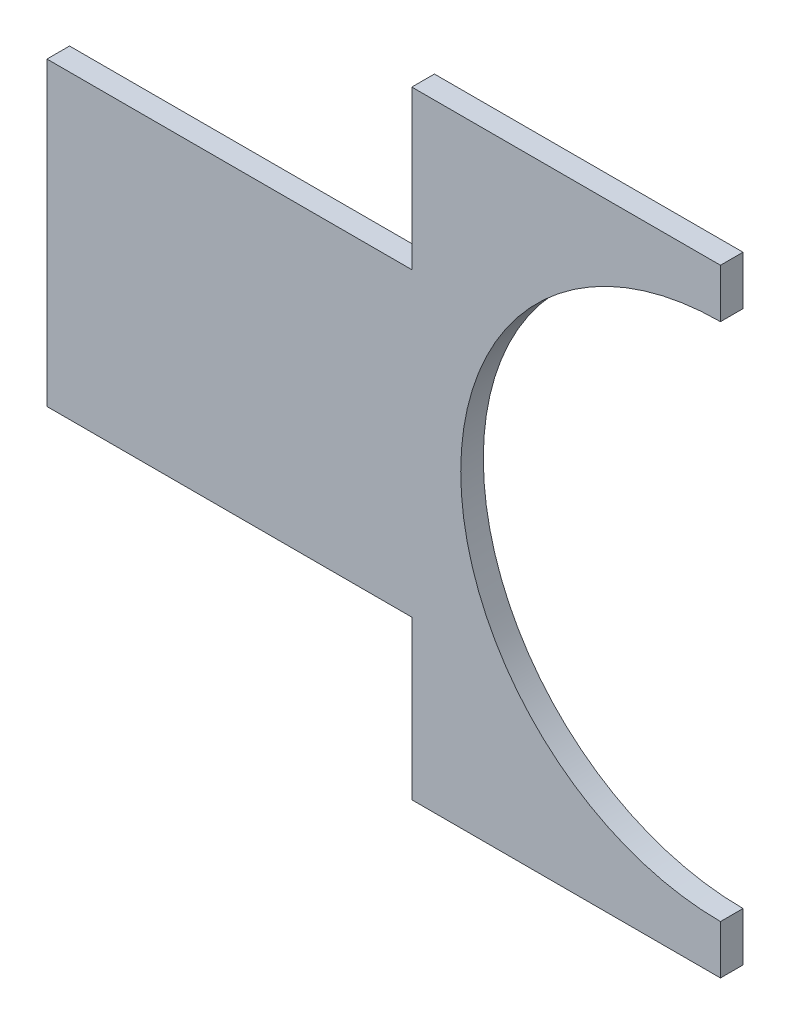
ISO-10303-21;
HEADER;
FILE_DESCRIPTION(('STEP AP214'),'2;1');
FILE_NAME('part.step','',(''),(''),'','','');
FILE_SCHEMA(('AUTOMOTIVE_DESIGN { 1 0 10303 214 1 1 1 1 }'));
ENDSEC;
DATA;
#1=APPLICATION_CONTEXT('core data for automotive mechanical design processes');
#2=APPLICATION_PROTOCOL_DEFINITION('international standard','automotive_design',2000,#1);
#3=PRODUCT_CONTEXT('',#1,'mechanical');
#4=PRODUCT('Part','Part','',(#3));
#5=PRODUCT_RELATED_PRODUCT_CATEGORY('part','',(#4));
#6=PRODUCT_DEFINITION_FORMATION('','',#4);
#7=PRODUCT_DEFINITION_CONTEXT('part definition',#1,'design');
#8=PRODUCT_DEFINITION('design','',#6,#7);
#9=PRODUCT_DEFINITION_SHAPE('','',#8);
#10=(LENGTH_UNIT() NAMED_UNIT(*) SI_UNIT(.MILLI.,.METRE.));
#11=(NAMED_UNIT(*) PLANE_ANGLE_UNIT() SI_UNIT($,.RADIAN.));
#12=(NAMED_UNIT(*) SI_UNIT($,.STERADIAN.) SOLID_ANGLE_UNIT());
#13=UNCERTAINTY_MEASURE_WITH_UNIT(LENGTH_MEASURE(1.E-05),#10,'distance_accuracy_value','');
#14=(GEOMETRIC_REPRESENTATION_CONTEXT(3) GLOBAL_UNCERTAINTY_ASSIGNED_CONTEXT((#13)) GLOBAL_UNIT_ASSIGNED_CONTEXT((#10,
#11,#12)) REPRESENTATION_CONTEXT('',''));
#15=CARTESIAN_POINT('',(0.,0.,0.));
#16=DIRECTION('',(0.,0.,1.));
#17=DIRECTION('',(1.,0.,0.));
#18=AXIS2_PLACEMENT_3D('',#15,#16,#17);
#19=CARTESIAN_POINT('',(-55.,40.,6.));
#20=DIRECTION('',(1.,0.,0.));
#21=DIRECTION('',(0.,1.,0.));
#22=AXIS2_PLACEMENT_3D('',#19,#20,#21);
#23=PLANE('',#22);
#24=DIRECTION('',(0.,-1.,0.));
#25=VECTOR('',#24,1.);
#26=CARTESIAN_POINT('',(-55.,40.,0.));
#27=LINE('',#26,#25);
#28=CARTESIAN_POINT('',(-55.,40.,0.));
#29=VERTEX_POINT('',#28);
#30=CARTESIAN_POINT('',(-55.,-40.,0.));
#31=VERTEX_POINT('',#30);
#32=EDGE_CURVE('E167',#29,#31,#27,.T.);
#33=ORIENTED_EDGE('',*,*,#32,.T.);
#34=DIRECTION('',(0.,0.,-1.));
#35=VECTOR('',#34,1.);
#36=CARTESIAN_POINT('',(-55.,-40.,6.));
#37=LINE('',#36,#35);
#38=CARTESIAN_POINT('',(-55.,-40.,6.));
#39=VERTEX_POINT('',#38);
#40=EDGE_CURVE('E11',#39,#31,#37,.T.);
#41=ORIENTED_EDGE('',*,*,#40,.F.);
#42=DIRECTION('',(0.,-1.,0.));
#43=VECTOR('',#42,1.);
#44=CARTESIAN_POINT('',(-55.,40.,6.));
#45=LINE('',#44,#43);
#46=CARTESIAN_POINT('',(-55.,40.,6.));
#47=VERTEX_POINT('',#46);
#48=EDGE_CURVE('E180',#47,#39,#45,.T.);
#49=ORIENTED_EDGE('',*,*,#48,.F.);
#50=DIRECTION('',(0.,0.,-1.));
#51=VECTOR('',#50,1.);
#52=CARTESIAN_POINT('',(-55.,40.,6.));
#53=LINE('',#52,#51);
#54=EDGE_CURVE('E50',#47,#29,#53,.T.);
#55=ORIENTED_EDGE('',*,*,#54,.T.);
#56=EDGE_LOOP('',(#33,#41,#49,#55));
#57=FACE_BOUND('',#56,.T.);
#58=ADVANCED_FACE('F43',(#57),#23,.F.);
#59=CARTESIAN_POINT('',(55.,-40.,6.));
#60=DIRECTION('',(0.,1.,0.));
#61=DIRECTION('',(-1.,0.,0.));
#62=AXIS2_PLACEMENT_3D('',#59,#60,#61);
#63=PLANE('',#62);
#64=DIRECTION('',(1.,0.,0.));
#65=VECTOR('',#64,1.);
#66=CARTESIAN_POINT('',(55.,-40.,0.));
#67=LINE('',#66,#65);
#68=CARTESIAN_POINT('',(42.,-40.,0.));
#69=VERTEX_POINT('',#68);
#70=EDGE_CURVE('E61',#31,#69,#67,.T.);
#71=ORIENTED_EDGE('',*,*,#70,.T.);
#72=DIRECTION('',(0.,0.,1.));
#73=VECTOR('',#72,1.);
#74=CARTESIAN_POINT('',(42.,-40.,-116.036222792712));
#75=LINE('',#74,#73);
#76=CARTESIAN_POINT('',(42.,-40.,6.));
#77=VERTEX_POINT('',#76);
#78=EDGE_CURVE('E57',#69,#77,#75,.T.);
#79=ORIENTED_EDGE('',*,*,#78,.T.);
#80=DIRECTION('',(1.,0.,0.));
#81=VECTOR('',#80,1.);
#82=CARTESIAN_POINT('',(55.,-40.,6.));
#83=LINE('',#82,#81);
#84=EDGE_CURVE('E138',#39,#77,#83,.T.);
#85=ORIENTED_EDGE('',*,*,#84,.F.);
#86=ORIENTED_EDGE('',*,*,#40,.T.);
#87=EDGE_LOOP('',(#71,#79,#85,#86));
#88=FACE_BOUND('',#87,.T.);
#89=ADVANCED_FACE('F200',(#88),#63,.F.);
#90=CARTESIAN_POINT('',(55.,40.,6.));
#91=DIRECTION('',(0.,-1.,0.));
#92=DIRECTION('',(1.,0.,0.));
#93=AXIS2_PLACEMENT_3D('',#90,#91,#92);
#94=PLANE('',#93);
#95=DIRECTION('',(-1.,0.,0.));
#96=VECTOR('',#95,1.);
#97=CARTESIAN_POINT('',(55.,40.,6.));
#98=LINE('',#97,#96);
#99=CARTESIAN_POINT('',(42.,40.,6.));
#100=VERTEX_POINT('',#99);
#101=EDGE_CURVE('E184',#100,#47,#98,.T.);
#102=ORIENTED_EDGE('',*,*,#101,.F.);
#103=DIRECTION('',(0.,0.,1.));
#104=VECTOR('',#103,1.);
#105=CARTESIAN_POINT('',(42.,40.,-116.036222792712));
#106=LINE('',#105,#104);
#107=CARTESIAN_POINT('',(42.,40.,0.));
#108=VERTEX_POINT('',#107);
#109=EDGE_CURVE('E171',#108,#100,#106,.T.);
#110=ORIENTED_EDGE('',*,*,#109,.F.);
#111=DIRECTION('',(-1.,0.,0.));
#112=VECTOR('',#111,1.);
#113=CARTESIAN_POINT('',(55.,40.,0.));
#114=LINE('',#113,#112);
#115=EDGE_CURVE('E182',#108,#29,#114,.T.);
#116=ORIENTED_EDGE('',*,*,#115,.T.);
#117=ORIENTED_EDGE('',*,*,#54,.F.);
#118=EDGE_LOOP('',(#102,#110,#116,#117));
#119=FACE_BOUND('',#118,.T.);
#120=ADVANCED_FACE('F203',(#119),#94,.F.);
#121=CARTESIAN_POINT('',(0.,0.,6.));
#122=DIRECTION('',(0.,0.,-1.));
#123=DIRECTION('',(-1.,0.,0.));
#124=AXIS2_PLACEMENT_3D('',#121,#122,#123);
#125=PLANE('',#124);
#126=ORIENTED_EDGE('',*,*,#48,.T.);
#127=ORIENTED_EDGE('',*,*,#84,.T.);
#128=DIRECTION('',(0.,-1.,0.));
#129=VECTOR('',#128,1.);
#130=CARTESIAN_POINT('',(42.,0.,6.));
#131=LINE('',#130,#129);
#132=CARTESIAN_POINT('',(42.,-82.05,6.));
#133=VERTEX_POINT('',#132);
#134=EDGE_CURVE('E120',#77,#133,#131,.T.);
#135=ORIENTED_EDGE('',*,*,#134,.T.);
#136=DIRECTION('',(1.,0.,0.));
#137=VECTOR('',#136,1.);
#138=CARTESIAN_POINT('',(0.,-82.05,6.));
#139=LINE('',#138,#137);
#140=CARTESIAN_POINT('',(124.05,-82.05,6.));
#141=VERTEX_POINT('',#140);
#142=EDGE_CURVE('E127',#133,#141,#139,.T.);
#143=ORIENTED_EDGE('',*,*,#142,.T.);
#144=DIRECTION('',(0.,-1.,0.));
#145=VECTOR('',#144,1.);
#146=CARTESIAN_POINT('',(124.05,0.,6.));
#147=LINE('',#146,#145);
#148=CARTESIAN_POINT('',(124.05,-69.05,6.));
#149=VERTEX_POINT('',#148);
#150=EDGE_CURVE('E144',#149,#141,#147,.T.);
#151=ORIENTED_EDGE('',*,*,#150,.F.);
#152=CARTESIAN_POINT('',(124.05,0.,6.));
#153=DIRECTION('',(0.,0.,1.));
#154=DIRECTION('',(1.,0.,0.));
#155=AXIS2_PLACEMENT_3D('',#152,#153,#154);
#156=CIRCLE('',#155,69.05);
#157=CARTESIAN_POINT('',(124.05,69.05,6.));
#158=VERTEX_POINT('',#157);
#159=EDGE_CURVE('E160',#158,#149,#156,.T.);
#160=ORIENTED_EDGE('',*,*,#159,.F.);
#161=DIRECTION('',(0.,-1.,0.));
#162=VECTOR('',#161,1.);
#163=CARTESIAN_POINT('',(124.05,0.,6.));
#164=LINE('',#163,#162);
#165=CARTESIAN_POINT('',(124.05,82.05,6.));
#166=VERTEX_POINT('',#165);
#167=EDGE_CURVE('E152',#166,#158,#164,.T.);
#168=ORIENTED_EDGE('',*,*,#167,.F.);
#169=DIRECTION('',(1.,0.,0.));
#170=VECTOR('',#169,1.);
#171=CARTESIAN_POINT('',(0.,82.05,6.));
#172=LINE('',#171,#170);
#173=CARTESIAN_POINT('',(42.,82.05,6.));
#174=VERTEX_POINT('',#173);
#175=EDGE_CURVE('E153',#174,#166,#172,.T.);
#176=ORIENTED_EDGE('',*,*,#175,.F.);
#177=DIRECTION('',(0.,-1.,0.));
#178=VECTOR('',#177,1.);
#179=CARTESIAN_POINT('',(42.,0.,6.));
#180=LINE('',#179,#178);
#181=EDGE_CURVE('E148',#174,#100,#180,.T.);
#182=ORIENTED_EDGE('',*,*,#181,.T.);
#183=ORIENTED_EDGE('',*,*,#101,.T.);
#184=EDGE_LOOP('',(#126,#127,#135,#143,#151,#160,#168,#176,#182,#183));
#185=FACE_BOUND('',#184,.T.);
#186=ADVANCED_FACE('F137',(#185),#125,.F.);
#187=CARTESIAN_POINT('',(0.,0.,0.));
#188=DIRECTION('',(0.,0.,-1.));
#189=DIRECTION('',(-1.,0.,0.));
#190=AXIS2_PLACEMENT_3D('',#187,#188,#189);
#191=PLANE('',#190);
#192=ORIENTED_EDGE('',*,*,#32,.F.);
#193=ORIENTED_EDGE('',*,*,#115,.F.);
#194=DIRECTION('',(0.,-1.,0.));
#195=VECTOR('',#194,1.);
#196=CARTESIAN_POINT('',(42.,0.,0.));
#197=LINE('',#196,#195);
#198=CARTESIAN_POINT('',(42.,82.05,0.));
#199=VERTEX_POINT('',#198);
#200=EDGE_CURVE('E162',#199,#108,#197,.T.);
#201=ORIENTED_EDGE('',*,*,#200,.F.);
#202=DIRECTION('',(1.,0.,0.));
#203=VECTOR('',#202,1.);
#204=CARTESIAN_POINT('',(0.,82.05,0.));
#205=LINE('',#204,#203);
#206=CARTESIAN_POINT('',(124.05,82.05,0.));
#207=VERTEX_POINT('',#206);
#208=EDGE_CURVE('E164',#199,#207,#205,.T.);
#209=ORIENTED_EDGE('',*,*,#208,.T.);
#210=DIRECTION('',(0.,-1.,0.));
#211=VECTOR('',#210,1.);
#212=CARTESIAN_POINT('',(124.05,0.,0.));
#213=LINE('',#212,#211);
#214=CARTESIAN_POINT('',(124.05,69.05,0.));
#215=VERTEX_POINT('',#214);
#216=EDGE_CURVE('E151',#207,#215,#213,.T.);
#217=ORIENTED_EDGE('',*,*,#216,.T.);
#218=CARTESIAN_POINT('',(124.05,0.,0.));
#219=DIRECTION('',(0.,0.,-1.));
#220=DIRECTION('',(-1.,0.,0.));
#221=AXIS2_PLACEMENT_3D('',#218,#219,#220);
#222=CIRCLE('',#221,69.05);
#223=CARTESIAN_POINT('',(124.05,-69.05,0.));
#224=VERTEX_POINT('',#223);
#225=EDGE_CURVE('E168',#215,#224,#222,.F.);
#226=ORIENTED_EDGE('',*,*,#225,.T.);
#227=DIRECTION('',(0.,-1.,0.));
#228=VECTOR('',#227,1.);
#229=CARTESIAN_POINT('',(124.05,0.,0.));
#230=LINE('',#229,#228);
#231=CARTESIAN_POINT('',(124.05,-82.05,0.));
#232=VERTEX_POINT('',#231);
#233=EDGE_CURVE('E134',#224,#232,#230,.T.);
#234=ORIENTED_EDGE('',*,*,#233,.T.);
#235=DIRECTION('',(1.,0.,0.));
#236=VECTOR('',#235,1.);
#237=CARTESIAN_POINT('',(0.,-82.05,0.));
#238=LINE('',#237,#236);
#239=CARTESIAN_POINT('',(42.,-82.05,0.));
#240=VERTEX_POINT('',#239);
#241=EDGE_CURVE('E146',#240,#232,#238,.T.);
#242=ORIENTED_EDGE('',*,*,#241,.F.);
#243=DIRECTION('',(0.,-1.,0.));
#244=VECTOR('',#243,1.);
#245=CARTESIAN_POINT('',(42.,0.,0.));
#246=LINE('',#245,#244);
#247=EDGE_CURVE('E122',#69,#240,#246,.T.);
#248=ORIENTED_EDGE('',*,*,#247,.F.);
#249=ORIENTED_EDGE('',*,*,#70,.F.);
#250=EDGE_LOOP('',(#192,#193,#201,#209,#217,#226,#234,#242,#248,#249));
#251=FACE_BOUND('',#250,.T.);
#252=ADVANCED_FACE('F197',(#251),#191,.T.);
#253=CARTESIAN_POINT('',(124.05,0.,-116.036222792712));
#254=DIRECTION('',(0.,0.,1.));
#255=DIRECTION('',(1.,0.,0.));
#256=AXIS2_PLACEMENT_3D('',#253,#254,#255);
#257=CYLINDRICAL_SURFACE('',#256,69.05);
#258=ORIENTED_EDGE('',*,*,#225,.F.);
#259=DIRECTION('',(0.,0.,1.));
#260=VECTOR('',#259,1.);
#261=CARTESIAN_POINT('',(124.05,69.05,-116.036222792712));
#262=LINE('',#261,#260);
#263=EDGE_CURVE('E163',#215,#158,#262,.T.);
#264=ORIENTED_EDGE('',*,*,#263,.T.);
#265=ORIENTED_EDGE('',*,*,#159,.T.);
#266=DIRECTION('',(0.,0.,1.));
#267=VECTOR('',#266,1.);
#268=CARTESIAN_POINT('',(124.05,-69.05,-116.036222792712));
#269=LINE('',#268,#267);
#270=EDGE_CURVE('E147',#224,#149,#269,.T.);
#271=ORIENTED_EDGE('',*,*,#270,.F.);
#272=EDGE_LOOP('',(#258,#264,#265,#271));
#273=FACE_BOUND('',#272,.T.);
#274=ADVANCED_FACE('F217',(#273),#257,.F.);
#275=CARTESIAN_POINT('',(42.,0.,-116.036222792712));
#276=DIRECTION('',(-1.,0.,0.));
#277=DIRECTION('',(0.,-1.,0.));
#278=AXIS2_PLACEMENT_3D('',#275,#276,#277);
#279=PLANE('',#278);
#280=DIRECTION('',(0.,0.,1.));
#281=VECTOR('',#280,1.);
#282=CARTESIAN_POINT('',(42.,82.05,-116.036222792712));
#283=LINE('',#282,#281);
#284=EDGE_CURVE('E157',#199,#174,#283,.T.);
#285=ORIENTED_EDGE('',*,*,#284,.F.);
#286=ORIENTED_EDGE('',*,*,#200,.T.);
#287=ORIENTED_EDGE('',*,*,#109,.T.);
#288=ORIENTED_EDGE('',*,*,#181,.F.);
#289=EDGE_LOOP('',(#285,#286,#287,#288));
#290=FACE_BOUND('',#289,.T.);
#291=ADVANCED_FACE('F206',(#290),#279,.T.);
#292=CARTESIAN_POINT('',(0.,82.05,-116.036222792712));
#293=DIRECTION('',(0.,-1.,0.));
#294=DIRECTION('',(0.,0.,-1.));
#295=AXIS2_PLACEMENT_3D('',#292,#293,#294);
#296=PLANE('',#295);
#297=ORIENTED_EDGE('',*,*,#208,.F.);
#298=ORIENTED_EDGE('',*,*,#284,.T.);
#299=ORIENTED_EDGE('',*,*,#175,.T.);
#300=DIRECTION('',(0.,0.,1.));
#301=VECTOR('',#300,1.);
#302=CARTESIAN_POINT('',(124.05,82.05,-116.036222792712));
#303=LINE('',#302,#301);
#304=EDGE_CURVE('E156',#207,#166,#303,.T.);
#305=ORIENTED_EDGE('',*,*,#304,.F.);
#306=EDGE_LOOP('',(#297,#298,#299,#305));
#307=FACE_BOUND('',#306,.T.);
#308=ADVANCED_FACE('F209',(#307),#296,.F.);
#309=CARTESIAN_POINT('',(124.05,0.,-116.036222792712));
#310=DIRECTION('',(-1.,0.,0.));
#311=DIRECTION('',(0.,-1.,0.));
#312=AXIS2_PLACEMENT_3D('',#309,#310,#311);
#313=PLANE('',#312);
#314=ORIENTED_EDGE('',*,*,#216,.F.);
#315=ORIENTED_EDGE('',*,*,#304,.T.);
#316=ORIENTED_EDGE('',*,*,#167,.T.);
#317=ORIENTED_EDGE('',*,*,#263,.F.);
#318=EDGE_LOOP('',(#314,#315,#316,#317));
#319=FACE_BOUND('',#318,.T.);
#320=ADVANCED_FACE('F212',(#319),#313,.F.);
#321=CARTESIAN_POINT('',(124.05,0.,-116.036222792712));
#322=DIRECTION('',(-1.,0.,0.));
#323=DIRECTION('',(0.,-1.,0.));
#324=AXIS2_PLACEMENT_3D('',#321,#322,#323);
#325=PLANE('',#324);
#326=ORIENTED_EDGE('',*,*,#233,.F.);
#327=ORIENTED_EDGE('',*,*,#270,.T.);
#328=ORIENTED_EDGE('',*,*,#150,.T.);
#329=DIRECTION('',(0.,0.,1.));
#330=VECTOR('',#329,1.);
#331=CARTESIAN_POINT('',(124.05,-82.05,-116.036222792712));
#332=LINE('',#331,#330);
#333=EDGE_CURVE('E130',#232,#141,#332,.T.);
#334=ORIENTED_EDGE('',*,*,#333,.F.);
#335=EDGE_LOOP('',(#326,#327,#328,#334));
#336=FACE_BOUND('',#335,.T.);
#337=ADVANCED_FACE('F222',(#336),#325,.F.);
#338=CARTESIAN_POINT('',(0.,-82.05,-116.036222792712));
#339=DIRECTION('',(0.,-1.,0.));
#340=DIRECTION('',(0.,0.,-1.));
#341=AXIS2_PLACEMENT_3D('',#338,#339,#340);
#342=PLANE('',#341);
#343=DIRECTION('',(0.,0.,1.));
#344=VECTOR('',#343,1.);
#345=CARTESIAN_POINT('',(42.,-82.05,-116.036222792712));
#346=LINE('',#345,#344);
#347=EDGE_CURVE('E116',#240,#133,#346,.T.);
#348=ORIENTED_EDGE('',*,*,#347,.F.);
#349=ORIENTED_EDGE('',*,*,#241,.T.);
#350=ORIENTED_EDGE('',*,*,#333,.T.);
#351=ORIENTED_EDGE('',*,*,#142,.F.);
#352=EDGE_LOOP('',(#348,#349,#350,#351));
#353=FACE_BOUND('',#352,.T.);
#354=ADVANCED_FACE('F128',(#353),#342,.T.);
#355=CARTESIAN_POINT('',(42.,0.,-116.036222792712));
#356=DIRECTION('',(-1.,0.,0.));
#357=DIRECTION('',(0.,-1.,0.));
#358=AXIS2_PLACEMENT_3D('',#355,#356,#357);
#359=PLANE('',#358);
#360=ORIENTED_EDGE('',*,*,#78,.F.);
#361=ORIENTED_EDGE('',*,*,#247,.T.);
#362=ORIENTED_EDGE('',*,*,#347,.T.);
#363=ORIENTED_EDGE('',*,*,#134,.F.);
#364=EDGE_LOOP('',(#360,#361,#362,#363));
#365=FACE_BOUND('',#364,.T.);
#366=ADVANCED_FACE('F118',(#365),#359,.T.);
#367=CLOSED_SHELL('',(#58,#89,#120,#186,#252,#274,#291,#308,#320,#337,#354,#366));
#368=MANIFOLD_SOLID_BREP('B2',#367);
#369=ADVANCED_BREP_SHAPE_REPRESENTATION('',(#18,#368),#14);
#370=SHAPE_DEFINITION_REPRESENTATION(#9,#369);
ENDSEC;
END-ISO-10303-21;
